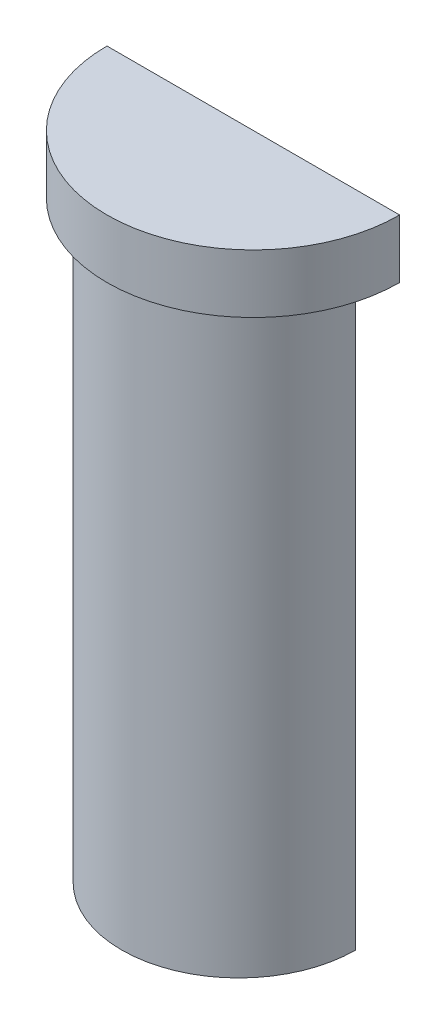
ISO-10303-21;
HEADER;
FILE_DESCRIPTION(('STEP AP214'),'2;1');
FILE_NAME('part.step','',(''),(''),'','','');
FILE_SCHEMA(('AUTOMOTIVE_DESIGN { 1 0 10303 214 1 1 1 1 }'));
ENDSEC;
DATA;
#1=APPLICATION_CONTEXT('core data for automotive mechanical design processes');
#2=APPLICATION_PROTOCOL_DEFINITION('international standard','automotive_design',2000,#1);
#3=PRODUCT_CONTEXT('',#1,'mechanical');
#4=PRODUCT('Part','Part','',(#3));
#5=PRODUCT_RELATED_PRODUCT_CATEGORY('part','',(#4));
#6=PRODUCT_DEFINITION_FORMATION('','',#4);
#7=PRODUCT_DEFINITION_CONTEXT('part definition',#1,'design');
#8=PRODUCT_DEFINITION('design','',#6,#7);
#9=PRODUCT_DEFINITION_SHAPE('','',#8);
#10=(LENGTH_UNIT() NAMED_UNIT(*) SI_UNIT(.MILLI.,.METRE.));
#11=(NAMED_UNIT(*) PLANE_ANGLE_UNIT() SI_UNIT($,.RADIAN.));
#12=(NAMED_UNIT(*) SI_UNIT($,.STERADIAN.) SOLID_ANGLE_UNIT());
#13=UNCERTAINTY_MEASURE_WITH_UNIT(LENGTH_MEASURE(1.E-05),#10,'distance_accuracy_value','');
#14=(GEOMETRIC_REPRESENTATION_CONTEXT(3) GLOBAL_UNCERTAINTY_ASSIGNED_CONTEXT((#13)) GLOBAL_UNIT_ASSIGNED_CONTEXT((#10,
#11,#12)) REPRESENTATION_CONTEXT('',''));
#15=CARTESIAN_POINT('',(0.,0.,0.));
#16=DIRECTION('',(0.,0.,1.));
#17=DIRECTION('',(1.,0.,0.));
#18=AXIS2_PLACEMENT_3D('',#15,#16,#17);
#19=CARTESIAN_POINT('',(2.,5.,0.));
#20=DIRECTION('',(0.,-1.,0.));
#21=DIRECTION('',(0.,0.,-1.));
#22=AXIS2_PLACEMENT_3D('',#19,#20,#21);
#23=CYLINDRICAL_SURFACE('',#22,2.);
#24=CARTESIAN_POINT('',(2.,-5.,0.));
#25=DIRECTION('',(0.,1.,0.));
#26=DIRECTION('',(0.,0.,1.));
#27=AXIS2_PLACEMENT_3D('',#24,#25,#26);
#28=CIRCLE('',#27,2.);
#29=CARTESIAN_POINT('',(0.,-5.,0.));
#30=VERTEX_POINT('',#29);
#31=CARTESIAN_POINT('',(4.,-5.,0.));
#32=VERTEX_POINT('',#31);
#33=EDGE_CURVE('E118',#30,#32,#28,.T.);
#34=ORIENTED_EDGE('',*,*,#33,.T.);
#35=DIRECTION('',(0.,-1.,0.));
#36=VECTOR('',#35,1.);
#37=CARTESIAN_POINT('',(4.,5.,0.));
#38=LINE('',#37,#36);
#39=CARTESIAN_POINT('',(4.,5.,0.));
#40=VERTEX_POINT('',#39);
#41=EDGE_CURVE('E11',#40,#32,#38,.T.);
#42=ORIENTED_EDGE('',*,*,#41,.F.);
#43=CARTESIAN_POINT('',(2.,5.,0.));
#44=DIRECTION('',(0.,1.,0.));
#45=DIRECTION('',(0.,0.,1.));
#46=AXIS2_PLACEMENT_3D('',#43,#44,#45);
#47=CIRCLE('',#46,2.);
#48=CARTESIAN_POINT('',(0.,5.,0.));
#49=VERTEX_POINT('',#48);
#50=EDGE_CURVE('E74',#49,#40,#47,.T.);
#51=ORIENTED_EDGE('',*,*,#50,.F.);
#52=DIRECTION('',(0.,-1.,0.));
#53=VECTOR('',#52,1.);
#54=CARTESIAN_POINT('',(0.,5.,0.));
#55=LINE('',#54,#53);
#56=EDGE_CURVE('E52',#49,#30,#55,.T.);
#57=ORIENTED_EDGE('',*,*,#56,.T.);
#58=EDGE_LOOP('',(#34,#42,#51,#57));
#59=FACE_BOUND('',#58,.T.);
#60=ADVANCED_FACE('F43',(#59),#23,.T.);
#61=CARTESIAN_POINT('',(0.,5.,0.));
#62=DIRECTION('',(0.,0.,1.));
#63=DIRECTION('',(1.,0.,0.));
#64=AXIS2_PLACEMENT_3D('',#61,#62,#63);
#65=PLANE('',#64);
#66=DIRECTION('',(-1.,0.,0.));
#67=VECTOR('',#66,1.);
#68=CARTESIAN_POINT('',(0.,-5.,0.));
#69=LINE('',#68,#67);
#70=EDGE_CURVE('E68',#32,#30,#69,.T.);
#71=ORIENTED_EDGE('',*,*,#70,.T.);
#72=ORIENTED_EDGE('',*,*,#56,.F.);
#73=DIRECTION('',(-1.,0.,0.));
#74=VECTOR('',#73,1.);
#75=CARTESIAN_POINT('',(0.,5.,0.));
#76=LINE('',#75,#74);
#77=EDGE_CURVE('E58',#40,#49,#76,.T.);
#78=ORIENTED_EDGE('',*,*,#77,.F.);
#79=ORIENTED_EDGE('',*,*,#41,.T.);
#80=EDGE_LOOP('',(#71,#72,#78,#79));
#81=FACE_BOUND('',#80,.T.);
#82=ADVANCED_FACE('F130',(#81),#65,.F.);
#83=CARTESIAN_POINT('',(2.,-5.,0.));
#84=DIRECTION('',(0.,1.,0.));
#85=DIRECTION('',(0.,0.,1.));
#86=AXIS2_PLACEMENT_3D('',#83,#84,#85);
#87=PLANE('',#86);
#88=ORIENTED_EDGE('',*,*,#33,.F.);
#89=ORIENTED_EDGE('',*,*,#70,.F.);
#90=EDGE_LOOP('',(#88,#89));
#91=FACE_BOUND('',#90,.T.);
#92=ADVANCED_FACE('F128',(#91),#87,.F.);
#93=CARTESIAN_POINT('',(2.,5.,-0.25));
#94=DIRECTION('',(0.,1.,0.));
#95=DIRECTION('',(0.,0.,1.));
#96=AXIS2_PLACEMENT_3D('',#93,#94,#95);
#97=PLANE('',#96);
#98=CARTESIAN_POINT('',(2.,5.,-0.25));
#99=DIRECTION('',(0.,1.,0.));
#100=DIRECTION('',(0.,0.,1.));
#101=AXIS2_PLACEMENT_3D('',#98,#99,#100);
#102=CIRCLE('',#101,2.5);
#103=CARTESIAN_POINT('',(-0.5,5.,-0.25));
#104=VERTEX_POINT('',#103);
#105=CARTESIAN_POINT('',(4.5,5.,-0.25));
#106=VERTEX_POINT('',#105);
#107=EDGE_CURVE('E103',#104,#106,#102,.T.);
#108=ORIENTED_EDGE('',*,*,#107,.F.);
#109=DIRECTION('',(-1.,0.,0.));
#110=VECTOR('',#109,1.);
#111=CARTESIAN_POINT('',(-0.5,5.,-0.25));
#112=LINE('',#111,#110);
#113=EDGE_CURVE('E91',#106,#104,#112,.T.);
#114=ORIENTED_EDGE('',*,*,#113,.F.);
#115=EDGE_LOOP('',(#108,#114));
#116=FACE_BOUND('',#115,.T.);
#117=ORIENTED_EDGE('',*,*,#77,.T.);
#118=ORIENTED_EDGE('',*,*,#50,.T.);
#119=EDGE_LOOP('',(#117,#118));
#120=FACE_BOUND('',#119,.T.);
#121=ADVANCED_FACE('F109',(#116,#120),#97,.F.);
#122=CARTESIAN_POINT('',(2.,6.,-0.25));
#123=DIRECTION('',(0.,-1.,0.));
#124=DIRECTION('',(0.,0.,-1.));
#125=AXIS2_PLACEMENT_3D('',#122,#123,#124);
#126=CYLINDRICAL_SURFACE('',#125,2.5);
#127=ORIENTED_EDGE('',*,*,#107,.T.);
#128=DIRECTION('',(0.,-1.,0.));
#129=VECTOR('',#128,1.);
#130=CARTESIAN_POINT('',(4.5,6.,-0.25));
#131=LINE('',#130,#129);
#132=CARTESIAN_POINT('',(4.5,6.,-0.25));
#133=VERTEX_POINT('',#132);
#134=EDGE_CURVE('E97',#133,#106,#131,.T.);
#135=ORIENTED_EDGE('',*,*,#134,.F.);
#136=CARTESIAN_POINT('',(2.,6.,-0.25));
#137=DIRECTION('',(0.,1.,0.));
#138=DIRECTION('',(0.,0.,1.));
#139=AXIS2_PLACEMENT_3D('',#136,#137,#138);
#140=CIRCLE('',#139,2.5);
#141=CARTESIAN_POINT('',(-0.5,6.,-0.25));
#142=VERTEX_POINT('',#141);
#143=EDGE_CURVE('E102',#142,#133,#140,.T.);
#144=ORIENTED_EDGE('',*,*,#143,.F.);
#145=DIRECTION('',(0.,-1.,0.));
#146=VECTOR('',#145,1.);
#147=CARTESIAN_POINT('',(-0.5,6.,-0.25));
#148=LINE('',#147,#146);
#149=EDGE_CURVE('E94',#142,#104,#148,.T.);
#150=ORIENTED_EDGE('',*,*,#149,.T.);
#151=EDGE_LOOP('',(#127,#135,#144,#150));
#152=FACE_BOUND('',#151,.T.);
#153=ADVANCED_FACE('F106',(#152),#126,.T.);
#154=CARTESIAN_POINT('',(-0.5,6.,-0.25));
#155=DIRECTION('',(0.,0.,1.));
#156=DIRECTION('',(1.,0.,0.));
#157=AXIS2_PLACEMENT_3D('',#154,#155,#156);
#158=PLANE('',#157);
#159=ORIENTED_EDGE('',*,*,#113,.T.);
#160=ORIENTED_EDGE('',*,*,#149,.F.);
#161=DIRECTION('',(-1.,0.,0.));
#162=VECTOR('',#161,1.);
#163=CARTESIAN_POINT('',(-0.5,6.,-0.25));
#164=LINE('',#163,#162);
#165=EDGE_CURVE('E81',#133,#142,#164,.T.);
#166=ORIENTED_EDGE('',*,*,#165,.F.);
#167=ORIENTED_EDGE('',*,*,#134,.T.);
#168=EDGE_LOOP('',(#159,#160,#166,#167));
#169=FACE_BOUND('',#168,.T.);
#170=ADVANCED_FACE('F93',(#169),#158,.F.);
#171=CARTESIAN_POINT('',(2.,6.,-0.25));
#172=DIRECTION('',(0.,1.,0.));
#173=DIRECTION('',(0.,0.,1.));
#174=AXIS2_PLACEMENT_3D('',#171,#172,#173);
#175=PLANE('',#174);
#176=ORIENTED_EDGE('',*,*,#143,.T.);
#177=ORIENTED_EDGE('',*,*,#165,.T.);
#178=EDGE_LOOP('',(#176,#177));
#179=FACE_BOUND('',#178,.T.);
#180=ADVANCED_FACE('F171',(#179),#175,.T.);
#181=CLOSED_SHELL('',(#60,#82,#92,#121,#153,#170,#180));
#182=MANIFOLD_SOLID_BREP('B2',#181);
#183=ADVANCED_BREP_SHAPE_REPRESENTATION('',(#18,#182),#14);
#184=SHAPE_DEFINITION_REPRESENTATION(#9,#183);
ENDSEC;
END-ISO-10303-21;
